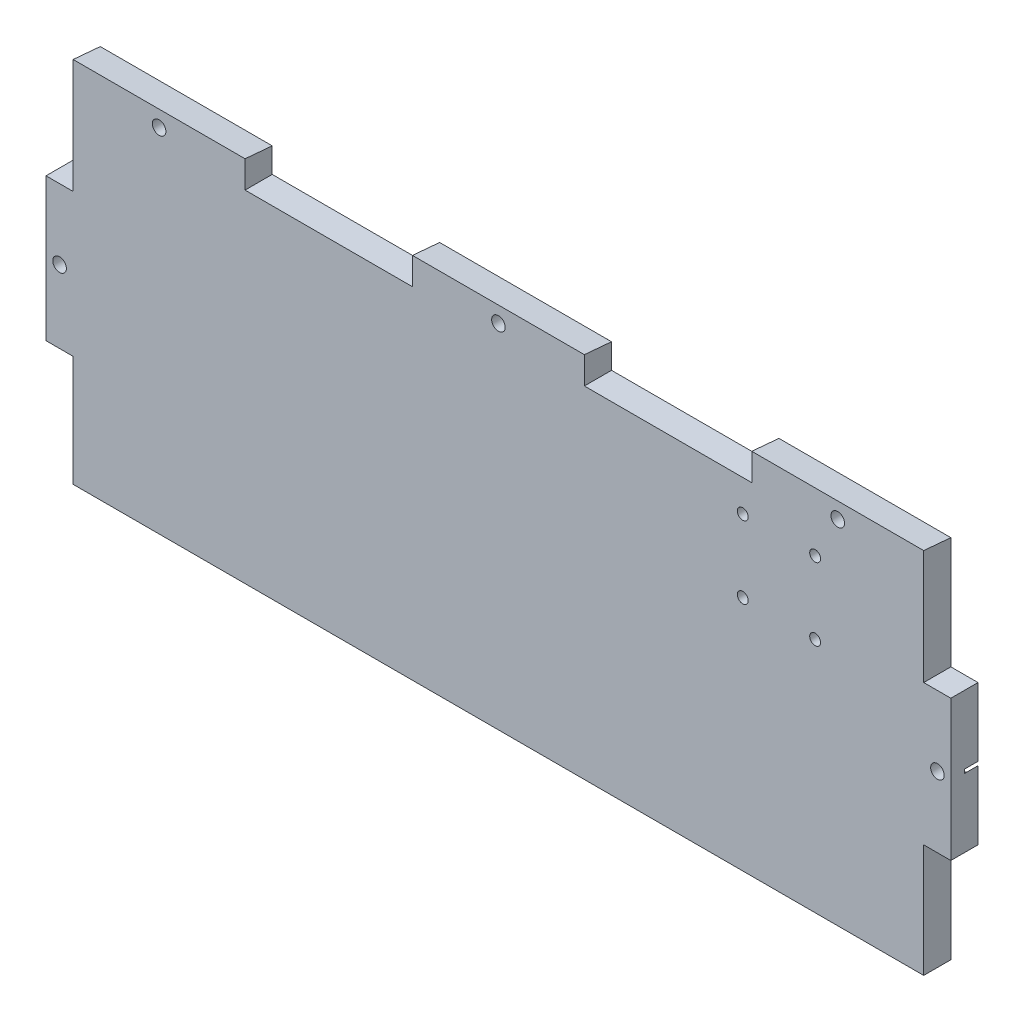
ISO-10303-21;
HEADER;
FILE_DESCRIPTION(('STEP AP214'),'2;1');
FILE_NAME('part.step','',(''),(''),'','','');
FILE_SCHEMA(('AUTOMOTIVE_DESIGN { 1 0 10303 214 1 1 1 1 }'));
ENDSEC;
DATA;
#1=APPLICATION_CONTEXT('core data for automotive mechanical design processes');
#2=APPLICATION_PROTOCOL_DEFINITION('international standard','automotive_design',2000,#1);
#3=PRODUCT_CONTEXT('',#1,'mechanical');
#4=PRODUCT('Part','Part','',(#3));
#5=PRODUCT_RELATED_PRODUCT_CATEGORY('part','',(#4));
#6=PRODUCT_DEFINITION_FORMATION('','',#4);
#7=PRODUCT_DEFINITION_CONTEXT('part definition',#1,'design');
#8=PRODUCT_DEFINITION('design','',#6,#7);
#9=PRODUCT_DEFINITION_SHAPE('','',#8);
#10=(LENGTH_UNIT() NAMED_UNIT(*) SI_UNIT(.MILLI.,.METRE.));
#11=(NAMED_UNIT(*) PLANE_ANGLE_UNIT() SI_UNIT($,.RADIAN.));
#12=(NAMED_UNIT(*) SI_UNIT($,.STERADIAN.) SOLID_ANGLE_UNIT());
#13=UNCERTAINTY_MEASURE_WITH_UNIT(LENGTH_MEASURE(1.E-05),#10,'distance_accuracy_value','');
#14=(GEOMETRIC_REPRESENTATION_CONTEXT(3) GLOBAL_UNCERTAINTY_ASSIGNED_CONTEXT((#13)) GLOBAL_UNIT_ASSIGNED_CONTEXT((#10,
#11,#12)) REPRESENTATION_CONTEXT('',''));
#15=CARTESIAN_POINT('',(0.,0.,0.));
#16=DIRECTION('',(0.,0.,1.));
#17=DIRECTION('',(1.,0.,0.));
#18=AXIS2_PLACEMENT_3D('',#15,#16,#17);
#19=CARTESIAN_POINT('',(-679.157205454483,81.33,6.));
#20=DIRECTION('',(0.,-0.996194698091746,0.0871557427476549));
#21=DIRECTION('',(0.,-0.0871557427476549,-0.996194698091746));
#22=AXIS2_PLACEMENT_3D('',#19,#20,#21);
#23=PLANE('',#22);
#24=DIRECTION('',(-1.,0.,0.));
#25=VECTOR('',#24,1.);
#26=CARTESIAN_POINT('',(0.,81.33,6.));
#27=LINE('',#26,#25);
#28=CARTESIAN_POINT('',(-75.,81.33,6.));
#29=VERTEX_POINT('',#28);
#30=CARTESIAN_POINT('',(-113.,81.33,6.));
#31=VERTEX_POINT('',#30);
#32=EDGE_CURVE('E434',#29,#31,#27,.T.);
#33=ORIENTED_EDGE('',*,*,#32,.F.);
#34=DIRECTION('',(0.,-0.0871557427476549,-0.996194698091746));
#35=VECTOR('',#34,1.);
#36=CARTESIAN_POINT('',(-75.,81.33,6.));
#37=LINE('',#36,#35);
#38=CARTESIAN_POINT('',(-75.,80.8050680188445,0.));
#39=VERTEX_POINT('',#38);
#40=EDGE_CURVE('E257',#29,#39,#37,.T.);
#41=ORIENTED_EDGE('',*,*,#40,.T.);
#42=DIRECTION('',(1.,0.,0.));
#43=VECTOR('',#42,1.);
#44=CARTESIAN_POINT('',(0.,80.8050680188444,0.));
#45=LINE('',#44,#43);
#46=CARTESIAN_POINT('',(-113.,80.8050680188445,0.));
#47=VERTEX_POINT('',#46);
#48=EDGE_CURVE('E453',#47,#39,#45,.T.);
#49=ORIENTED_EDGE('',*,*,#48,.F.);
#50=DIRECTION('',(0.,0.0871557427476549,0.996194698091746));
#51=VECTOR('',#50,1.);
#52=CARTESIAN_POINT('',(-113.,81.33,6.));
#53=LINE('',#52,#51);
#54=EDGE_CURVE('E248',#47,#31,#53,.T.);
#55=ORIENTED_EDGE('',*,*,#54,.T.);
#56=EDGE_LOOP('',(#33,#41,#49,#55));
#57=FACE_BOUND('',#56,.T.);
#58=ADVANCED_FACE('F34',(#57),#23,.F.);
#59=CARTESIAN_POINT('',(-150.,81.33,6.));
#60=VERTEX_POINT('',#59);
#61=CARTESIAN_POINT('',(-188.,81.33,6.));
#62=VERTEX_POINT('',#61);
#63=EDGE_CURVE('E435',#60,#62,#27,.T.);
#64=ORIENTED_EDGE('',*,*,#63,.F.);
#65=DIRECTION('',(0.,-0.0871557427476549,-0.996194698091746));
#66=VECTOR('',#65,1.);
#67=CARTESIAN_POINT('',(-150.,81.33,6.00000000000021));
#68=LINE('',#67,#66);
#69=CARTESIAN_POINT('',(-150.,80.8050680188445,0.));
#70=VERTEX_POINT('',#69);
#71=EDGE_CURVE('E251',#60,#70,#68,.T.);
#72=ORIENTED_EDGE('',*,*,#71,.T.);
#73=CARTESIAN_POINT('',(-188.,80.8050680188445,0.));
#74=VERTEX_POINT('',#73);
#75=EDGE_CURVE('E252',#74,#70,#45,.T.);
#76=ORIENTED_EDGE('',*,*,#75,.F.);
#77=DIRECTION('',(0.,-0.0871557427476549,-0.996194698091746));
#78=VECTOR('',#77,1.);
#79=CARTESIAN_POINT('',(-188.,80.7122072762415,-1.06140314482546));
#80=LINE('',#79,#78);
#81=EDGE_CURVE('E463',#62,#74,#80,.T.);
#82=ORIENTED_EDGE('',*,*,#81,.F.);
#83=EDGE_LOOP('',(#64,#72,#76,#82));
#84=FACE_BOUND('',#83,.T.);
#85=ADVANCED_FACE('F511',(#84),#23,.F.);
#86=CARTESIAN_POINT('',(0.,0.,6.));
#87=DIRECTION('',(-1.,0.,0.));
#88=DIRECTION('',(0.,0.,1.));
#89=AXIS2_PLACEMENT_3D('',#86,#87,#88);
#90=PLANE('',#89);
#91=DIRECTION('',(0.,0.,1.));
#92=VECTOR('',#91,1.);
#93=CARTESIAN_POINT('',(0.,56.0675340094222,6.));
#94=LINE('',#93,#92);
#95=CARTESIAN_POINT('',(0.,56.0675340094222,0.));
#96=VERTEX_POINT('',#95);
#97=CARTESIAN_POINT('',(0.,56.0675340094222,6.));
#98=VERTEX_POINT('',#97);
#99=EDGE_CURVE('E223',#96,#98,#94,.T.);
#100=ORIENTED_EDGE('',*,*,#99,.F.);
#101=DIRECTION('',(0.,1.,0.));
#102=VECTOR('',#101,1.);
#103=CARTESIAN_POINT('',(0.,0.,0.));
#104=LINE('',#103,#102);
#105=CARTESIAN_POINT('',(0.,80.8050680188444,0.));
#106=VERTEX_POINT('',#105);
#107=EDGE_CURVE('E401',#96,#106,#104,.T.);
#108=ORIENTED_EDGE('',*,*,#107,.T.);
#109=DIRECTION('',(0.,0.0871557427476549,0.996194698091746));
#110=VECTOR('',#109,1.);
#111=CARTESIAN_POINT('',(0.,80.7122072762415,-1.06140314482546));
#112=LINE('',#111,#110);
#113=CARTESIAN_POINT('',(0.,81.33,6.));
#114=VERTEX_POINT('',#113);
#115=EDGE_CURVE('E406',#106,#114,#112,.T.);
#116=ORIENTED_EDGE('',*,*,#115,.T.);
#117=DIRECTION('',(0.,1.,0.));
#118=VECTOR('',#117,1.);
#119=CARTESIAN_POINT('',(0.,0.,6.));
#120=LINE('',#119,#118);
#121=EDGE_CURVE('E225',#98,#114,#120,.T.);
#122=ORIENTED_EDGE('',*,*,#121,.F.);
#123=EDGE_LOOP('',(#100,#108,#116,#122));
#124=FACE_BOUND('',#123,.T.);
#125=ADVANCED_FACE('F36',(#124),#90,.F.);
#126=DIRECTION('',(0.,0.,-1.));
#127=VECTOR('',#126,1.);
#128=CARTESIAN_POINT('',(0.,25.,6.));
#129=LINE('',#128,#127);
#130=CARTESIAN_POINT('',(0.,25.,6.));
#131=VERTEX_POINT('',#130);
#132=CARTESIAN_POINT('',(0.,25.,0.));
#133=VERTEX_POINT('',#132);
#134=EDGE_CURVE('E219',#131,#133,#129,.T.);
#135=ORIENTED_EDGE('',*,*,#134,.F.);
#136=CARTESIAN_POINT('',(0.,0.,6.));
#137=VERTEX_POINT('',#136);
#138=EDGE_CURVE('E390',#137,#131,#120,.T.);
#139=ORIENTED_EDGE('',*,*,#138,.F.);
#140=DIRECTION('',(0.,0.,-1.));
#141=VECTOR('',#140,1.);
#142=CARTESIAN_POINT('',(0.,0.,6.));
#143=LINE('',#142,#141);
#144=CARTESIAN_POINT('',(0.,0.,0.));
#145=VERTEX_POINT('',#144);
#146=EDGE_CURVE('E446',#137,#145,#143,.T.);
#147=ORIENTED_EDGE('',*,*,#146,.T.);
#148=EDGE_CURVE('E395',#145,#133,#104,.T.);
#149=ORIENTED_EDGE('',*,*,#148,.T.);
#150=EDGE_LOOP('',(#135,#139,#147,#149));
#151=FACE_BOUND('',#150,.T.);
#152=ADVANCED_FACE('F449',(#151),#90,.F.);
#153=CARTESIAN_POINT('',(-188.,0.,6.));
#154=DIRECTION('',(1.,0.,0.));
#155=DIRECTION('',(0.,0.,-1.));
#156=AXIS2_PLACEMENT_3D('',#153,#154,#155);
#157=PLANE('',#156);
#158=DIRECTION('',(0.,0.,1.));
#159=VECTOR('',#158,1.);
#160=CARTESIAN_POINT('',(-188.,24.5,6.));
#161=LINE('',#160,#159);
#162=CARTESIAN_POINT('',(-188.,24.5,0.));
#163=VERTEX_POINT('',#162);
#164=CARTESIAN_POINT('',(-188.,24.5,6.));
#165=VERTEX_POINT('',#164);
#166=EDGE_CURVE('E478',#163,#165,#161,.T.);
#167=ORIENTED_EDGE('',*,*,#166,.F.);
#168=DIRECTION('',(0.,-1.,0.));
#169=VECTOR('',#168,1.);
#170=CARTESIAN_POINT('',(-188.,0.,0.));
#171=LINE('',#170,#169);
#172=CARTESIAN_POINT('',(-188.,0.,0.));
#173=VERTEX_POINT('',#172);
#174=EDGE_CURVE('E400',#163,#173,#171,.T.);
#175=ORIENTED_EDGE('',*,*,#174,.T.);
#176=DIRECTION('',(0.,0.,-1.));
#177=VECTOR('',#176,1.);
#178=CARTESIAN_POINT('',(-188.,0.,6.));
#179=LINE('',#178,#177);
#180=CARTESIAN_POINT('',(-188.,0.,6.));
#181=VERTEX_POINT('',#180);
#182=EDGE_CURVE('E448',#181,#173,#179,.T.);
#183=ORIENTED_EDGE('',*,*,#182,.F.);
#184=DIRECTION('',(0.,-1.,0.));
#185=VECTOR('',#184,1.);
#186=CARTESIAN_POINT('',(-188.,0.,6.));
#187=LINE('',#186,#185);
#188=EDGE_CURVE('E425',#165,#181,#187,.T.);
#189=ORIENTED_EDGE('',*,*,#188,.F.);
#190=EDGE_LOOP('',(#167,#175,#183,#189));
#191=FACE_BOUND('',#190,.T.);
#192=ADVANCED_FACE('F565',(#191),#157,.F.);
#193=DIRECTION('',(0.,0.,-1.));
#194=VECTOR('',#193,1.);
#195=CARTESIAN_POINT('',(-188.,56.0675340094222,6.));
#196=LINE('',#195,#194);
#197=CARTESIAN_POINT('',(-188.,56.0675340094222,6.));
#198=VERTEX_POINT('',#197);
#199=CARTESIAN_POINT('',(-188.,56.0675340094222,0.));
#200=VERTEX_POINT('',#199);
#201=EDGE_CURVE('E236',#198,#200,#196,.T.);
#202=ORIENTED_EDGE('',*,*,#201,.F.);
#203=EDGE_CURVE('E427',#62,#198,#187,.T.);
#204=ORIENTED_EDGE('',*,*,#203,.F.);
#205=ORIENTED_EDGE('',*,*,#81,.T.);
#206=EDGE_CURVE('E403',#74,#200,#171,.T.);
#207=ORIENTED_EDGE('',*,*,#206,.T.);
#208=EDGE_LOOP('',(#202,#204,#205,#207));
#209=FACE_BOUND('',#208,.T.);
#210=ADVANCED_FACE('F505',(#209),#157,.F.);
#211=CARTESIAN_POINT('',(0.,0.,6.));
#212=DIRECTION('',(0.,1.,0.));
#213=DIRECTION('',(-1.,0.,0.));
#214=AXIS2_PLACEMENT_3D('',#211,#212,#213);
#215=PLANE('',#214);
#216=DIRECTION('',(1.,0.,0.));
#217=VECTOR('',#216,1.);
#218=CARTESIAN_POINT('',(0.,0.,0.));
#219=LINE('',#218,#217);
#220=EDGE_CURVE('E397',#173,#145,#219,.T.);
#221=ORIENTED_EDGE('',*,*,#220,.T.);
#222=ORIENTED_EDGE('',*,*,#146,.F.);
#223=DIRECTION('',(1.,0.,0.));
#224=VECTOR('',#223,1.);
#225=CARTESIAN_POINT('',(0.,0.,6.));
#226=LINE('',#225,#224);
#227=EDGE_CURVE('E415',#181,#137,#226,.T.);
#228=ORIENTED_EDGE('',*,*,#227,.F.);
#229=ORIENTED_EDGE('',*,*,#182,.T.);
#230=EDGE_LOOP('',(#221,#222,#228,#229));
#231=FACE_BOUND('',#230,.T.);
#232=ADVANCED_FACE('F444',(#231),#215,.F.);
#233=CARTESIAN_POINT('',(0.,0.,6.));
#234=DIRECTION('',(0.,0.,1.));
#235=DIRECTION('',(1.,0.,0.));
#236=AXIS2_PLACEMENT_3D('',#233,#234,#235);
#237=PLANE('',#236);
#238=CARTESIAN_POINT('',(-40.,52.33,6.));
#239=DIRECTION('',(0.,0.,1.));
#240=DIRECTION('',(1.,0.,0.));
#241=AXIS2_PLACEMENT_3D('',#238,#239,#240);
#242=CIRCLE('',#241,1.2);
#243=CARTESIAN_POINT('',(-38.8,52.33,6.));
#244=VERTEX_POINT('',#243);
#245=EDGE_CURVE('E300',#244,#244,#242,.T.);
#246=ORIENTED_EDGE('',*,*,#245,.F.);
#247=EDGE_LOOP('',(#246));
#248=FACE_BOUND('',#247,.T.);
#249=CARTESIAN_POINT('',(-40.,68.33,6.));
#250=DIRECTION('',(0.,0.,1.));
#251=DIRECTION('',(1.,0.,0.));
#252=AXIS2_PLACEMENT_3D('',#249,#250,#251);
#253=CIRCLE('',#252,1.20000000000001);
#254=CARTESIAN_POINT('',(-38.8,68.33,6.));
#255=VERTEX_POINT('',#254);
#256=EDGE_CURVE('E290',#255,#255,#253,.T.);
#257=ORIENTED_EDGE('',*,*,#256,.F.);
#258=EDGE_LOOP('',(#257));
#259=FACE_BOUND('',#258,.T.);
#260=CARTESIAN_POINT('',(-24.,52.33,6.));
#261=DIRECTION('',(0.,0.,1.));
#262=DIRECTION('',(1.,0.,0.));
#263=AXIS2_PLACEMENT_3D('',#260,#261,#262);
#264=CIRCLE('',#263,1.2);
#265=CARTESIAN_POINT('',(-22.8,52.33,6.));
#266=VERTEX_POINT('',#265);
#267=EDGE_CURVE('E287',#266,#266,#264,.T.);
#268=ORIENTED_EDGE('',*,*,#267,.F.);
#269=EDGE_LOOP('',(#268));
#270=FACE_BOUND('',#269,.T.);
#271=CARTESIAN_POINT('',(-24.,68.33,6.));
#272=DIRECTION('',(0.,0.,1.));
#273=DIRECTION('',(1.,0.,0.));
#274=AXIS2_PLACEMENT_3D('',#271,#272,#273);
#275=CIRCLE('',#274,1.20000000000002);
#276=CARTESIAN_POINT('',(-22.8,68.33,6.));
#277=VERTEX_POINT('',#276);
#278=EDGE_CURVE('E284',#277,#277,#275,.T.);
#279=ORIENTED_EDGE('',*,*,#278,.F.);
#280=EDGE_LOOP('',(#279));
#281=FACE_BOUND('',#280,.T.);
#282=CARTESIAN_POINT('',(-191.,40.5675340094222,6.));
#283=DIRECTION('',(0.,0.,-1.));
#284=DIRECTION('',(-1.,0.,0.));
#285=AXIS2_PLACEMENT_3D('',#282,#283,#284);
#286=CIRCLE('',#285,1.5);
#287=CARTESIAN_POINT('',(-192.5,40.5675340094222,6.));
#288=VERTEX_POINT('',#287);
#289=EDGE_CURVE('E280',#288,#288,#286,.T.);
#290=ORIENTED_EDGE('',*,*,#289,.T.);
#291=EDGE_LOOP('',(#290));
#292=FACE_BOUND('',#291,.T.);
#293=CARTESIAN_POINT('',(-169.,77.8050680188445,6.));
#294=DIRECTION('',(0.,0.,-1.));
#295=DIRECTION('',(-1.,0.,0.));
#296=AXIS2_PLACEMENT_3D('',#293,#294,#295);
#297=CIRCLE('',#296,1.5);
#298=CARTESIAN_POINT('',(-170.5,77.8050680188445,6.));
#299=VERTEX_POINT('',#298);
#300=EDGE_CURVE('E276',#299,#299,#297,.T.);
#301=ORIENTED_EDGE('',*,*,#300,.T.);
#302=EDGE_LOOP('',(#301));
#303=FACE_BOUND('',#302,.T.);
#304=CARTESIAN_POINT('',(-94.,77.8050680188445,6.));
#305=DIRECTION('',(0.,0.,-1.));
#306=DIRECTION('',(-1.,0.,0.));
#307=AXIS2_PLACEMENT_3D('',#304,#305,#306);
#308=CIRCLE('',#307,1.5);
#309=CARTESIAN_POINT('',(-95.5,77.8050680188445,6.));
#310=VERTEX_POINT('',#309);
#311=EDGE_CURVE('E272',#310,#310,#308,.T.);
#312=ORIENTED_EDGE('',*,*,#311,.T.);
#313=EDGE_LOOP('',(#312));
#314=FACE_BOUND('',#313,.T.);
#315=CARTESIAN_POINT('',(-19.,77.8050680188445,6.));
#316=DIRECTION('',(0.,0.,-1.));
#317=DIRECTION('',(-1.,0.,0.));
#318=AXIS2_PLACEMENT_3D('',#315,#316,#317);
#319=CIRCLE('',#318,1.5);
#320=CARTESIAN_POINT('',(-20.5,77.8050680188445,6.));
#321=VERTEX_POINT('',#320);
#322=EDGE_CURVE('E268',#321,#321,#319,.T.);
#323=ORIENTED_EDGE('',*,*,#322,.T.);
#324=EDGE_LOOP('',(#323));
#325=FACE_BOUND('',#324,.T.);
#326=CARTESIAN_POINT('',(3.03401441182416,40.5675340094222,6.));
#327=DIRECTION('',(0.,0.,-1.));
#328=DIRECTION('',(-1.,0.,0.));
#329=AXIS2_PLACEMENT_3D('',#326,#327,#328);
#330=CIRCLE('',#329,1.5);
#331=CARTESIAN_POINT('',(1.53401441182416,40.5675340094222,6.));
#332=VERTEX_POINT('',#331);
#333=EDGE_CURVE('E264',#332,#332,#330,.T.);
#334=ORIENTED_EDGE('',*,*,#333,.T.);
#335=EDGE_LOOP('',(#334));
#336=FACE_BOUND('',#335,.T.);
#337=DIRECTION('',(0.,-1.,0.));
#338=VECTOR('',#337,1.);
#339=CARTESIAN_POINT('',(-75.,81.33,6.));
#340=LINE('',#339,#338);
#341=CARTESIAN_POINT('',(-75.,75.33,6.));
#342=VERTEX_POINT('',#341);
#343=EDGE_CURVE('E338',#29,#342,#340,.T.);
#344=ORIENTED_EDGE('',*,*,#343,.F.);
#345=ORIENTED_EDGE('',*,*,#32,.T.);
#346=DIRECTION('',(0.,1.,0.));
#347=VECTOR('',#346,1.);
#348=CARTESIAN_POINT('',(-113.,81.33,6.));
#349=LINE('',#348,#347);
#350=CARTESIAN_POINT('',(-113.,75.33,6.));
#351=VERTEX_POINT('',#350);
#352=EDGE_CURVE('E365',#351,#31,#349,.T.);
#353=ORIENTED_EDGE('',*,*,#352,.F.);
#354=DIRECTION('',(1.,0.,0.));
#355=VECTOR('',#354,1.);
#356=CARTESIAN_POINT('',(-150.,75.33,6.));
#357=LINE('',#356,#355);
#358=CARTESIAN_POINT('',(-150.,75.33,6.));
#359=VERTEX_POINT('',#358);
#360=EDGE_CURVE('E374',#359,#351,#357,.T.);
#361=ORIENTED_EDGE('',*,*,#360,.F.);
#362=DIRECTION('',(0.,-1.,0.));
#363=VECTOR('',#362,1.);
#364=CARTESIAN_POINT('',(-150.,81.33,6.));
#365=LINE('',#364,#363);
#366=EDGE_CURVE('E359',#60,#359,#365,.T.);
#367=ORIENTED_EDGE('',*,*,#366,.F.);
#368=ORIENTED_EDGE('',*,*,#63,.T.);
#369=ORIENTED_EDGE('',*,*,#203,.T.);
#370=DIRECTION('',(1.,0.,0.));
#371=VECTOR('',#370,1.);
#372=CARTESIAN_POINT('',(-194.,56.0675340094222,6.));
#373=LINE('',#372,#371);
#374=CARTESIAN_POINT('',(-194.,56.0675340094222,6.));
#375=VERTEX_POINT('',#374);
#376=EDGE_CURVE('E465',#375,#198,#373,.T.);
#377=ORIENTED_EDGE('',*,*,#376,.F.);
#378=DIRECTION('',(0.,1.,0.));
#379=VECTOR('',#378,1.);
#380=CARTESIAN_POINT('',(-194.,56.0675340094222,6.));
#381=LINE('',#380,#379);
#382=CARTESIAN_POINT('',(-194.,24.5,6.));
#383=VERTEX_POINT('',#382);
#384=EDGE_CURVE('E482',#383,#375,#381,.T.);
#385=ORIENTED_EDGE('',*,*,#384,.F.);
#386=DIRECTION('',(1.,0.,0.));
#387=VECTOR('',#386,1.);
#388=CARTESIAN_POINT('',(-194.,24.5,6.));
#389=LINE('',#388,#387);
#390=EDGE_CURVE('E484',#383,#165,#389,.T.);
#391=ORIENTED_EDGE('',*,*,#390,.T.);
#392=ORIENTED_EDGE('',*,*,#188,.T.);
#393=ORIENTED_EDGE('',*,*,#227,.T.);
#394=ORIENTED_EDGE('',*,*,#138,.T.);
#395=DIRECTION('',(-1.,0.,0.));
#396=VECTOR('',#395,1.);
#397=CARTESIAN_POINT('',(6.,25.,6.));
#398=LINE('',#397,#396);
#399=CARTESIAN_POINT('',(6.,25.,6.));
#400=VERTEX_POINT('',#399);
#401=EDGE_CURVE('E231',#400,#131,#398,.T.);
#402=ORIENTED_EDGE('',*,*,#401,.F.);
#403=DIRECTION('',(0.,-1.,0.));
#404=VECTOR('',#403,1.);
#405=CARTESIAN_POINT('',(6.,25.,6.));
#406=LINE('',#405,#404);
#407=CARTESIAN_POINT('',(6.,56.0675340094222,6.));
#408=VERTEX_POINT('',#407);
#409=EDGE_CURVE('E208',#408,#400,#406,.T.);
#410=ORIENTED_EDGE('',*,*,#409,.F.);
#411=DIRECTION('',(-1.,0.,0.));
#412=VECTOR('',#411,1.);
#413=CARTESIAN_POINT('',(6.,56.0675340094222,6.));
#414=LINE('',#413,#412);
#415=EDGE_CURVE('E213',#408,#98,#414,.T.);
#416=ORIENTED_EDGE('',*,*,#415,.T.);
#417=ORIENTED_EDGE('',*,*,#121,.T.);
#418=CARTESIAN_POINT('',(-38.,81.33,6.));
#419=VERTEX_POINT('',#418);
#420=EDGE_CURVE('E428',#114,#419,#27,.T.);
#421=ORIENTED_EDGE('',*,*,#420,.T.);
#422=DIRECTION('',(0.,1.,0.));
#423=VECTOR('',#422,1.);
#424=CARTESIAN_POINT('',(-38.,81.33,6.));
#425=LINE('',#424,#423);
#426=CARTESIAN_POINT('',(-38.,75.33,6.));
#427=VERTEX_POINT('',#426);
#428=EDGE_CURVE('E58',#427,#419,#425,.T.);
#429=ORIENTED_EDGE('',*,*,#428,.F.);
#430=DIRECTION('',(1.,0.,0.));
#431=VECTOR('',#430,1.);
#432=CARTESIAN_POINT('',(-75.,75.33,6.));
#433=LINE('',#432,#431);
#434=EDGE_CURVE('E353',#342,#427,#433,.T.);
#435=ORIENTED_EDGE('',*,*,#434,.F.);
#436=EDGE_LOOP('',(#344,#345,#353,#361,#367,#368,#369,#377,#385,#391,#392,#393,#394,#402,#410,
#416,#417,#421,#429,#435));
#437=FACE_BOUND('',#436,.T.);
#438=ADVANCED_FACE('F388',(#248,#259,#270,#281,#292,#303,#314,#325,#336,#437),#237,.T.);
#439=CARTESIAN_POINT('',(0.,0.,0.));
#440=DIRECTION('',(0.,0.,1.));
#441=DIRECTION('',(1.,0.,0.));
#442=AXIS2_PLACEMENT_3D('',#439,#440,#441);
#443=PLANE('',#442);
#444=CARTESIAN_POINT('',(-40.,52.33,0.));
#445=DIRECTION('',(0.,0.,1.));
#446=DIRECTION('',(1.,0.,0.));
#447=AXIS2_PLACEMENT_3D('',#444,#445,#446);
#448=CIRCLE('',#447,1.2);
#449=CARTESIAN_POINT('',(-38.8,52.33,0.));
#450=VERTEX_POINT('',#449);
#451=EDGE_CURVE('E38',#450,#450,#448,.T.);
#452=ORIENTED_EDGE('',*,*,#451,.T.);
#453=EDGE_LOOP('',(#452));
#454=FACE_BOUND('',#453,.T.);
#455=CARTESIAN_POINT('',(-40.,68.33,0.));
#456=DIRECTION('',(0.,0.,1.));
#457=DIRECTION('',(1.,0.,0.));
#458=AXIS2_PLACEMENT_3D('',#455,#456,#457);
#459=CIRCLE('',#458,1.20000000000001);
#460=CARTESIAN_POINT('',(-38.8,68.33,0.));
#461=VERTEX_POINT('',#460);
#462=EDGE_CURVE('E288',#461,#461,#459,.T.);
#463=ORIENTED_EDGE('',*,*,#462,.T.);
#464=EDGE_LOOP('',(#463));
#465=FACE_BOUND('',#464,.T.);
#466=CARTESIAN_POINT('',(-24.,52.33,0.));
#467=DIRECTION('',(0.,0.,1.));
#468=DIRECTION('',(1.,0.,0.));
#469=AXIS2_PLACEMENT_3D('',#466,#467,#468);
#470=CIRCLE('',#469,1.2);
#471=CARTESIAN_POINT('',(-22.8,52.33,0.));
#472=VERTEX_POINT('',#471);
#473=EDGE_CURVE('E285',#472,#472,#470,.T.);
#474=ORIENTED_EDGE('',*,*,#473,.T.);
#475=EDGE_LOOP('',(#474));
#476=FACE_BOUND('',#475,.T.);
#477=CARTESIAN_POINT('',(-24.,68.33,0.));
#478=DIRECTION('',(0.,0.,1.));
#479=DIRECTION('',(1.,0.,0.));
#480=AXIS2_PLACEMENT_3D('',#477,#478,#479);
#481=CIRCLE('',#480,1.20000000000002);
#482=CARTESIAN_POINT('',(-22.8,68.33,0.));
#483=VERTEX_POINT('',#482);
#484=EDGE_CURVE('E281',#483,#483,#481,.T.);
#485=ORIENTED_EDGE('',*,*,#484,.T.);
#486=EDGE_LOOP('',(#485));
#487=FACE_BOUND('',#486,.T.);
#488=CARTESIAN_POINT('',(-191.,40.5675340094222,0.));
#489=DIRECTION('',(0.,0.,-1.));
#490=DIRECTION('',(-1.,0.,0.));
#491=AXIS2_PLACEMENT_3D('',#488,#489,#490);
#492=CIRCLE('',#491,2.995);
#493=CARTESIAN_POINT('',(-193.995,40.5675340094222,0.));
#494=VERTEX_POINT('',#493);
#495=EDGE_CURVE('E315',#494,#494,#492,.T.);
#496=ORIENTED_EDGE('',*,*,#495,.F.);
#497=EDGE_LOOP('',(#496));
#498=FACE_BOUND('',#497,.T.);
#499=CARTESIAN_POINT('',(-169.,77.8050680188445,0.));
#500=DIRECTION('',(0.,0.,-1.));
#501=DIRECTION('',(-1.,0.,0.));
#502=AXIS2_PLACEMENT_3D('',#499,#500,#501);
#503=CIRCLE('',#502,2.995);
#504=CARTESIAN_POINT('',(-171.995,77.8050680188445,0.));
#505=VERTEX_POINT('',#504);
#506=EDGE_CURVE('E320',#505,#505,#503,.T.);
#507=ORIENTED_EDGE('',*,*,#506,.F.);
#508=EDGE_LOOP('',(#507));
#509=FACE_BOUND('',#508,.T.);
#510=CARTESIAN_POINT('',(-19.,77.8050680188445,0.));
#511=DIRECTION('',(0.,0.,-1.));
#512=DIRECTION('',(-1.,0.,0.));
#513=AXIS2_PLACEMENT_3D('',#510,#511,#512);
#514=CIRCLE('',#513,2.995);
#515=CARTESIAN_POINT('',(-21.995,77.8050680188445,0.));
#516=VERTEX_POINT('',#515);
#517=EDGE_CURVE('E326',#516,#516,#514,.T.);
#518=ORIENTED_EDGE('',*,*,#517,.F.);
#519=EDGE_LOOP('',(#518));
#520=FACE_BOUND('',#519,.T.);
#521=CARTESIAN_POINT('',(-94.,77.8050680188445,0.));
#522=DIRECTION('',(0.,0.,-1.));
#523=DIRECTION('',(-1.,0.,0.));
#524=AXIS2_PLACEMENT_3D('',#521,#522,#523);
#525=CIRCLE('',#524,2.995);
#526=CARTESIAN_POINT('',(-96.995,77.8050680188445,0.));
#527=VERTEX_POINT('',#526);
#528=EDGE_CURVE('E332',#527,#527,#525,.T.);
#529=ORIENTED_EDGE('',*,*,#528,.F.);
#530=EDGE_LOOP('',(#529));
#531=FACE_BOUND('',#530,.T.);
#532=DIRECTION('',(0.,1.,0.));
#533=VECTOR('',#532,1.);
#534=CARTESIAN_POINT('',(6.,25.,0.));
#535=LINE('',#534,#533);
#536=CARTESIAN_POINT('',(6.,40.9834119851954,0.));
#537=VERTEX_POINT('',#536);
#538=CARTESIAN_POINT('',(6.,56.0675340094222,0.));
#539=VERTEX_POINT('',#538);
#540=EDGE_CURVE('E196',#537,#539,#535,.T.);
#541=ORIENTED_EDGE('',*,*,#540,.F.);
#542=CARTESIAN_POINT('',(3.03401441182416,40.5675340094222,0.));
#543=DIRECTION('',(0.,0.,-1.));
#544=DIRECTION('',(-1.,0.,0.));
#545=AXIS2_PLACEMENT_3D('',#542,#543,#544);
#546=CIRCLE('',#545,2.995);
#547=CARTESIAN_POINT('',(6.,40.151656033649,0.));
#548=VERTEX_POINT('',#547);
#549=EDGE_CURVE('E184',#548,#537,#546,.T.);
#550=ORIENTED_EDGE('',*,*,#549,.F.);
#551=CARTESIAN_POINT('',(6.,25.,0.));
#552=VERTEX_POINT('',#551);
#553=EDGE_CURVE('E204',#552,#548,#535,.T.);
#554=ORIENTED_EDGE('',*,*,#553,.F.);
#555=DIRECTION('',(-1.,0.,0.));
#556=VECTOR('',#555,1.);
#557=CARTESIAN_POINT('',(6.,25.,0.));
#558=LINE('',#557,#556);
#559=EDGE_CURVE('E228',#552,#133,#558,.T.);
#560=ORIENTED_EDGE('',*,*,#559,.T.);
#561=ORIENTED_EDGE('',*,*,#148,.F.);
#562=ORIENTED_EDGE('',*,*,#220,.F.);
#563=ORIENTED_EDGE('',*,*,#174,.F.);
#564=DIRECTION('',(1.,0.,0.));
#565=VECTOR('',#564,1.);
#566=CARTESIAN_POINT('',(-194.,24.5,0.));
#567=LINE('',#566,#565);
#568=CARTESIAN_POINT('',(-194.,24.5,0.));
#569=VERTEX_POINT('',#568);
#570=EDGE_CURVE('E487',#569,#163,#567,.T.);
#571=ORIENTED_EDGE('',*,*,#570,.F.);
#572=DIRECTION('',(0.,-1.,0.));
#573=VECTOR('',#572,1.);
#574=CARTESIAN_POINT('',(-194.,56.0675340094222,0.));
#575=LINE('',#574,#573);
#576=CARTESIAN_POINT('',(-194.,56.0675340094222,0.));
#577=VERTEX_POINT('',#576);
#578=EDGE_CURVE('E573',#577,#569,#575,.T.);
#579=ORIENTED_EDGE('',*,*,#578,.F.);
#580=DIRECTION('',(1.,0.,0.));
#581=VECTOR('',#580,1.);
#582=CARTESIAN_POINT('',(-194.,56.0675340094222,0.));
#583=LINE('',#582,#581);
#584=EDGE_CURVE('E470',#577,#200,#583,.T.);
#585=ORIENTED_EDGE('',*,*,#584,.T.);
#586=ORIENTED_EDGE('',*,*,#206,.F.);
#587=ORIENTED_EDGE('',*,*,#75,.T.);
#588=DIRECTION('',(0.,-1.,0.));
#589=VECTOR('',#588,1.);
#590=CARTESIAN_POINT('',(-150.,81.33,0.));
#591=LINE('',#590,#589);
#592=CARTESIAN_POINT('',(-150.,75.33,0.));
#593=VERTEX_POINT('',#592);
#594=EDGE_CURVE('E361',#70,#593,#591,.T.);
#595=ORIENTED_EDGE('',*,*,#594,.T.);
#596=DIRECTION('',(1.,0.,0.));
#597=VECTOR('',#596,1.);
#598=CARTESIAN_POINT('',(-150.,75.33,0.));
#599=LINE('',#598,#597);
#600=CARTESIAN_POINT('',(-113.,75.33,0.));
#601=VERTEX_POINT('',#600);
#602=EDGE_CURVE('E364',#593,#601,#599,.T.);
#603=ORIENTED_EDGE('',*,*,#602,.T.);
#604=DIRECTION('',(0.,1.,0.));
#605=VECTOR('',#604,1.);
#606=CARTESIAN_POINT('',(-113.,81.33,0.));
#607=LINE('',#606,#605);
#608=EDGE_CURVE('E368',#601,#47,#607,.T.);
#609=ORIENTED_EDGE('',*,*,#608,.T.);
#610=ORIENTED_EDGE('',*,*,#48,.T.);
#611=DIRECTION('',(0.,-1.,0.));
#612=VECTOR('',#611,1.);
#613=CARTESIAN_POINT('',(-75.,81.33,0.));
#614=LINE('',#613,#612);
#615=CARTESIAN_POINT('',(-75.,75.33,0.));
#616=VERTEX_POINT('',#615);
#617=EDGE_CURVE('E341',#39,#616,#614,.T.);
#618=ORIENTED_EDGE('',*,*,#617,.T.);
#619=DIRECTION('',(1.,0.,0.));
#620=VECTOR('',#619,1.);
#621=CARTESIAN_POINT('',(-75.,75.33,0.));
#622=LINE('',#621,#620);
#623=CARTESIAN_POINT('',(-38.,75.33,0.));
#624=VERTEX_POINT('',#623);
#625=EDGE_CURVE('E344',#616,#624,#622,.T.);
#626=ORIENTED_EDGE('',*,*,#625,.T.);
#627=DIRECTION('',(0.,1.,0.));
#628=VECTOR('',#627,1.);
#629=CARTESIAN_POINT('',(-38.,81.33,0.));
#630=LINE('',#629,#628);
#631=CARTESIAN_POINT('',(-38.,80.8050680188445,0.));
#632=VERTEX_POINT('',#631);
#633=EDGE_CURVE('E347',#624,#632,#630,.T.);
#634=ORIENTED_EDGE('',*,*,#633,.T.);
#635=EDGE_CURVE('E450',#632,#106,#45,.T.);
#636=ORIENTED_EDGE('',*,*,#635,.T.);
#637=ORIENTED_EDGE('',*,*,#107,.F.);
#638=DIRECTION('',(-1.,0.,0.));
#639=VECTOR('',#638,1.);
#640=CARTESIAN_POINT('',(6.,56.0675340094222,0.));
#641=LINE('',#640,#639);
#642=EDGE_CURVE('E202',#539,#96,#641,.T.);
#643=ORIENTED_EDGE('',*,*,#642,.F.);
#644=EDGE_LOOP('',(#541,#550,#554,#560,#561,#562,#563,#571,#579,#585,#586,#587,#595,#603,#609,
#610,#618,#626,#634,#636,#637,#643));
#645=FACE_BOUND('',#644,.T.);
#646=ADVANCED_FACE('F199',(#454,#465,#476,#487,#498,#509,#520,#531,#645),#443,.F.);
#647=ORIENTED_EDGE('',*,*,#635,.F.);
#648=DIRECTION('',(0.,0.0871557427476549,0.996194698091746));
#649=VECTOR('',#648,1.);
#650=CARTESIAN_POINT('',(-38.,81.33,6.));
#651=LINE('',#650,#649);
#652=EDGE_CURVE('E255',#632,#419,#651,.T.);
#653=ORIENTED_EDGE('',*,*,#652,.T.);
#654=ORIENTED_EDGE('',*,*,#420,.F.);
#655=ORIENTED_EDGE('',*,*,#115,.F.);
#656=EDGE_LOOP('',(#647,#653,#654,#655));
#657=FACE_BOUND('',#656,.T.);
#658=ADVANCED_FACE('F462',(#657),#23,.F.);
#659=CARTESIAN_POINT('',(-194.,56.0675340094222,6.));
#660=DIRECTION('',(0.,-1.,0.));
#661=DIRECTION('',(0.,0.,-1.));
#662=AXIS2_PLACEMENT_3D('',#659,#660,#661);
#663=PLANE('',#662);
#664=ORIENTED_EDGE('',*,*,#201,.T.);
#665=ORIENTED_EDGE('',*,*,#584,.F.);
#666=DIRECTION('',(0.,0.,-1.));
#667=VECTOR('',#666,1.);
#668=CARTESIAN_POINT('',(-194.,56.0675340094222,6.));
#669=LINE('',#668,#667);
#670=EDGE_CURVE('E576',#375,#577,#669,.T.);
#671=ORIENTED_EDGE('',*,*,#670,.F.);
#672=ORIENTED_EDGE('',*,*,#376,.T.);
#673=EDGE_LOOP('',(#664,#665,#671,#672));
#674=FACE_BOUND('',#673,.T.);
#675=ADVANCED_FACE('F502',(#674),#663,.F.);
#676=CARTESIAN_POINT('',(-194.,24.5,6.));
#677=DIRECTION('',(0.,1.,0.));
#678=DIRECTION('',(0.,0.,1.));
#679=AXIS2_PLACEMENT_3D('',#676,#677,#678);
#680=PLANE('',#679);
#681=ORIENTED_EDGE('',*,*,#166,.T.);
#682=ORIENTED_EDGE('',*,*,#390,.F.);
#683=DIRECTION('',(0.,0.,1.));
#684=VECTOR('',#683,1.);
#685=CARTESIAN_POINT('',(-194.,24.5,6.));
#686=LINE('',#685,#684);
#687=EDGE_CURVE('E488',#569,#383,#686,.T.);
#688=ORIENTED_EDGE('',*,*,#687,.F.);
#689=ORIENTED_EDGE('',*,*,#570,.T.);
#690=EDGE_LOOP('',(#681,#682,#688,#689));
#691=FACE_BOUND('',#690,.T.);
#692=ADVANCED_FACE('F554',(#691),#680,.F.);
#693=CARTESIAN_POINT('',(-194.,0.,0.));
#694=DIRECTION('',(1.,0.,0.));
#695=DIRECTION('',(0.,0.,-1.));
#696=AXIS2_PLACEMENT_3D('',#693,#694,#695);
#697=PLANE('',#696);
#698=ORIENTED_EDGE('',*,*,#384,.T.);
#699=ORIENTED_EDGE('',*,*,#670,.T.);
#700=ORIENTED_EDGE('',*,*,#578,.T.);
#701=ORIENTED_EDGE('',*,*,#687,.T.);
#702=EDGE_LOOP('',(#698,#699,#700,#701));
#703=FACE_BOUND('',#702,.T.);
#704=ADVANCED_FACE('F579',(#703),#697,.F.);
#705=CARTESIAN_POINT('',(6.,25.,6.));
#706=DIRECTION('',(0.,1.,0.));
#707=DIRECTION('',(0.,0.,1.));
#708=AXIS2_PLACEMENT_3D('',#705,#706,#707);
#709=PLANE('',#708);
#710=ORIENTED_EDGE('',*,*,#134,.T.);
#711=ORIENTED_EDGE('',*,*,#559,.F.);
#712=DIRECTION('',(0.,0.,-1.));
#713=VECTOR('',#712,1.);
#714=CARTESIAN_POINT('',(6.,25.,6.));
#715=LINE('',#714,#713);
#716=EDGE_CURVE('E205',#400,#552,#715,.T.);
#717=ORIENTED_EDGE('',*,*,#716,.F.);
#718=ORIENTED_EDGE('',*,*,#401,.T.);
#719=EDGE_LOOP('',(#710,#711,#717,#718));
#720=FACE_BOUND('',#719,.T.);
#721=ADVANCED_FACE('F392',(#720),#709,.F.);
#722=CARTESIAN_POINT('',(6.,56.0675340094222,6.));
#723=DIRECTION('',(0.,-1.,0.));
#724=DIRECTION('',(0.,0.,-1.));
#725=AXIS2_PLACEMENT_3D('',#722,#723,#724);
#726=PLANE('',#725);
#727=ORIENTED_EDGE('',*,*,#99,.T.);
#728=ORIENTED_EDGE('',*,*,#415,.F.);
#729=DIRECTION('',(0.,0.,1.));
#730=VECTOR('',#729,1.);
#731=CARTESIAN_POINT('',(6.,56.0675340094222,6.));
#732=LINE('',#731,#730);
#733=EDGE_CURVE('E207',#539,#408,#732,.T.);
#734=ORIENTED_EDGE('',*,*,#733,.F.);
#735=ORIENTED_EDGE('',*,*,#642,.T.);
#736=EDGE_LOOP('',(#727,#728,#734,#735));
#737=FACE_BOUND('',#736,.T.);
#738=ADVANCED_FACE('F586',(#737),#726,.F.);
#739=CARTESIAN_POINT('',(6.,0.,0.));
#740=DIRECTION('',(-1.,0.,0.));
#741=DIRECTION('',(0.,0.,1.));
#742=AXIS2_PLACEMENT_3D('',#739,#740,#741);
#743=PLANE('',#742);
#744=DIRECTION('',(0.,-1.,0.));
#745=VECTOR('',#744,1.);
#746=CARTESIAN_POINT('',(6.,0.,3.));
#747=LINE('',#746,#745);
#748=CARTESIAN_POINT('',(6.,40.9834119851954,3.));
#749=VERTEX_POINT('',#748);
#750=CARTESIAN_POINT('',(6.,40.151656033649,3.));
#751=VERTEX_POINT('',#750);
#752=EDGE_CURVE('E198',#749,#751,#747,.T.);
#753=ORIENTED_EDGE('',*,*,#752,.F.);
#754=DIRECTION('',(0.,0.,-1.));
#755=VECTOR('',#754,1.);
#756=CARTESIAN_POINT('',(6.,40.9834119851954,3.));
#757=LINE('',#756,#755);
#758=EDGE_CURVE('E11',#749,#537,#757,.T.);
#759=ORIENTED_EDGE('',*,*,#758,.T.);
#760=ORIENTED_EDGE('',*,*,#540,.T.);
#761=ORIENTED_EDGE('',*,*,#733,.T.);
#762=ORIENTED_EDGE('',*,*,#409,.T.);
#763=ORIENTED_EDGE('',*,*,#716,.T.);
#764=ORIENTED_EDGE('',*,*,#553,.T.);
#765=DIRECTION('',(0.,0.,-1.));
#766=VECTOR('',#765,1.);
#767=CARTESIAN_POINT('',(6.,40.151656033649,3.));
#768=LINE('',#767,#766);
#769=EDGE_CURVE('E43',#548,#751,#768,.F.);
#770=ORIENTED_EDGE('',*,*,#769,.T.);
#771=EDGE_LOOP('',(#753,#759,#760,#761,#762,#763,#764,#770));
#772=FACE_BOUND('',#771,.T.);
#773=ADVANCED_FACE('F195',(#772),#743,.F.);
#774=CARTESIAN_POINT('',(-150.,81.33,0.));
#775=DIRECTION('',(-1.,0.,0.));
#776=DIRECTION('',(0.,-1.,0.));
#777=AXIS2_PLACEMENT_3D('',#774,#775,#776);
#778=PLANE('',#777);
#779=ORIENTED_EDGE('',*,*,#366,.T.);
#780=DIRECTION('',(0.,0.,1.));
#781=VECTOR('',#780,1.);
#782=CARTESIAN_POINT('',(-150.,75.33,0.));
#783=LINE('',#782,#781);
#784=EDGE_CURVE('E371',#593,#359,#783,.T.);
#785=ORIENTED_EDGE('',*,*,#784,.F.);
#786=ORIENTED_EDGE('',*,*,#594,.F.);
#787=ORIENTED_EDGE('',*,*,#71,.F.);
#788=EDGE_LOOP('',(#779,#785,#786,#787));
#789=FACE_BOUND('',#788,.T.);
#790=ADVANCED_FACE('F513',(#789),#778,.F.);
#791=CARTESIAN_POINT('',(-113.,81.33,0.));
#792=DIRECTION('',(1.,0.,0.));
#793=DIRECTION('',(0.,0.,-1.));
#794=AXIS2_PLACEMENT_3D('',#791,#792,#793);
#795=PLANE('',#794);
#796=ORIENTED_EDGE('',*,*,#608,.F.);
#797=DIRECTION('',(0.,0.,1.));
#798=VECTOR('',#797,1.);
#799=CARTESIAN_POINT('',(-113.,75.33,0.));
#800=LINE('',#799,#798);
#801=EDGE_CURVE('E224',#601,#351,#800,.T.);
#802=ORIENTED_EDGE('',*,*,#801,.T.);
#803=ORIENTED_EDGE('',*,*,#352,.T.);
#804=ORIENTED_EDGE('',*,*,#54,.F.);
#805=EDGE_LOOP('',(#796,#802,#803,#804));
#806=FACE_BOUND('',#805,.T.);
#807=ADVANCED_FACE('F521',(#806),#795,.F.);
#808=CARTESIAN_POINT('',(-150.,75.33,0.));
#809=DIRECTION('',(0.,-1.,0.));
#810=DIRECTION('',(1.,0.,0.));
#811=AXIS2_PLACEMENT_3D('',#808,#809,#810);
#812=PLANE('',#811);
#813=ORIENTED_EDGE('',*,*,#360,.T.);
#814=ORIENTED_EDGE('',*,*,#801,.F.);
#815=ORIENTED_EDGE('',*,*,#602,.F.);
#816=ORIENTED_EDGE('',*,*,#784,.T.);
#817=EDGE_LOOP('',(#813,#814,#815,#816));
#818=FACE_BOUND('',#817,.T.);
#819=ADVANCED_FACE('F518',(#818),#812,.F.);
#820=CARTESIAN_POINT('',(-75.,81.33,0.));
#821=DIRECTION('',(-1.,0.,0.));
#822=DIRECTION('',(0.,0.,1.));
#823=AXIS2_PLACEMENT_3D('',#820,#821,#822);
#824=PLANE('',#823);
#825=ORIENTED_EDGE('',*,*,#343,.T.);
#826=DIRECTION('',(0.,0.,1.));
#827=VECTOR('',#826,1.);
#828=CARTESIAN_POINT('',(-75.,75.33,0.));
#829=LINE('',#828,#827);
#830=EDGE_CURVE('E350',#616,#342,#829,.T.);
#831=ORIENTED_EDGE('',*,*,#830,.F.);
#832=ORIENTED_EDGE('',*,*,#617,.F.);
#833=ORIENTED_EDGE('',*,*,#40,.F.);
#834=EDGE_LOOP('',(#825,#831,#832,#833));
#835=FACE_BOUND('',#834,.T.);
#836=ADVANCED_FACE('F526',(#835),#824,.F.);
#837=CARTESIAN_POINT('',(-38.,81.33,0.));
#838=DIRECTION('',(1.,0.,0.));
#839=DIRECTION('',(0.,0.,-1.));
#840=AXIS2_PLACEMENT_3D('',#837,#838,#839);
#841=PLANE('',#840);
#842=ORIENTED_EDGE('',*,*,#633,.F.);
#843=DIRECTION('',(0.,0.,1.));
#844=VECTOR('',#843,1.);
#845=CARTESIAN_POINT('',(-38.,75.33,0.));
#846=LINE('',#845,#844);
#847=EDGE_CURVE('E357',#624,#427,#846,.T.);
#848=ORIENTED_EDGE('',*,*,#847,.T.);
#849=ORIENTED_EDGE('',*,*,#428,.T.);
#850=ORIENTED_EDGE('',*,*,#652,.F.);
#851=EDGE_LOOP('',(#842,#848,#849,#850));
#852=FACE_BOUND('',#851,.T.);
#853=ADVANCED_FACE('F530',(#852),#841,.F.);
#854=CARTESIAN_POINT('',(-75.,75.33,0.));
#855=DIRECTION('',(0.,-1.,0.));
#856=DIRECTION('',(1.,0.,0.));
#857=AXIS2_PLACEMENT_3D('',#854,#855,#856);
#858=PLANE('',#857);
#859=ORIENTED_EDGE('',*,*,#434,.T.);
#860=ORIENTED_EDGE('',*,*,#847,.F.);
#861=ORIENTED_EDGE('',*,*,#625,.F.);
#862=ORIENTED_EDGE('',*,*,#830,.T.);
#863=EDGE_LOOP('',(#859,#860,#861,#862));
#864=FACE_BOUND('',#863,.T.);
#865=ADVANCED_FACE('F529',(#864),#858,.F.);
#866=CARTESIAN_POINT('',(-94.,77.8050680188445,3.));
#867=DIRECTION('',(0.,0.,-1.));
#868=DIRECTION('',(-1.,0.,0.));
#869=AXIS2_PLACEMENT_3D('',#866,#867,#868);
#870=CYLINDRICAL_SURFACE('',#869,2.995);
#871=CARTESIAN_POINT('',(-94.,77.8050680188445,3.));
#872=DIRECTION('',(0.,0.,-1.));
#873=DIRECTION('',(-1.,0.,0.));
#874=AXIS2_PLACEMENT_3D('',#871,#872,#873);
#875=CIRCLE('',#874,2.995);
#876=CARTESIAN_POINT('',(-96.995,77.8050680188445,3.));
#877=VERTEX_POINT('',#876);
#878=EDGE_CURVE('E335',#877,#877,#875,.T.);
#879=ORIENTED_EDGE('',*,*,#878,.F.);
#880=EDGE_LOOP('',(#879));
#881=FACE_BOUND('',#880,.T.);
#882=ORIENTED_EDGE('',*,*,#528,.T.);
#883=EDGE_LOOP('',(#882));
#884=FACE_BOUND('',#883,.T.);
#885=ADVANCED_FACE('F537',(#881,#884),#870,.F.);
#886=CARTESIAN_POINT('',(-94.,77.8050680188445,3.));
#887=DIRECTION('',(0.,0.,-1.));
#888=DIRECTION('',(-1.,0.,0.));
#889=AXIS2_PLACEMENT_3D('',#886,#887,#888);
#890=PLANE('',#889);
#891=CARTESIAN_POINT('',(-94.,77.8050680188445,3.));
#892=DIRECTION('',(0.,0.,-1.));
#893=DIRECTION('',(-1.,0.,0.));
#894=AXIS2_PLACEMENT_3D('',#891,#892,#893);
#895=CIRCLE('',#894,1.5);
#896=CARTESIAN_POINT('',(-95.5,77.8050680188445,3.));
#897=VERTEX_POINT('',#896);
#898=EDGE_CURVE('E269',#897,#897,#895,.T.);
#899=ORIENTED_EDGE('',*,*,#898,.F.);
#900=EDGE_LOOP('',(#899));
#901=FACE_BOUND('',#900,.T.);
#902=ORIENTED_EDGE('',*,*,#878,.T.);
#903=EDGE_LOOP('',(#902));
#904=FACE_BOUND('',#903,.T.);
#905=ADVANCED_FACE('F636',(#901,#904),#890,.T.);
#906=CARTESIAN_POINT('',(-19.,77.8050680188445,3.));
#907=DIRECTION('',(0.,0.,-1.));
#908=DIRECTION('',(-1.,0.,0.));
#909=AXIS2_PLACEMENT_3D('',#906,#907,#908);
#910=CYLINDRICAL_SURFACE('',#909,2.995);
#911=CARTESIAN_POINT('',(-19.,77.8050680188445,3.));
#912=DIRECTION('',(0.,0.,-1.));
#913=DIRECTION('',(-1.,0.,0.));
#914=AXIS2_PLACEMENT_3D('',#911,#912,#913);
#915=CIRCLE('',#914,2.995);
#916=CARTESIAN_POINT('',(-21.995,77.8050680188445,3.));
#917=VERTEX_POINT('',#916);
#918=EDGE_CURVE('E329',#917,#917,#915,.T.);
#919=ORIENTED_EDGE('',*,*,#918,.F.);
#920=EDGE_LOOP('',(#919));
#921=FACE_BOUND('',#920,.T.);
#922=ORIENTED_EDGE('',*,*,#517,.T.);
#923=EDGE_LOOP('',(#922));
#924=FACE_BOUND('',#923,.T.);
#925=ADVANCED_FACE('F643',(#921,#924),#910,.F.);
#926=CARTESIAN_POINT('',(-19.,77.8050680188445,3.));
#927=DIRECTION('',(0.,0.,-1.));
#928=DIRECTION('',(-1.,0.,0.));
#929=AXIS2_PLACEMENT_3D('',#926,#927,#928);
#930=PLANE('',#929);
#931=CARTESIAN_POINT('',(-19.,77.8050680188445,3.));
#932=DIRECTION('',(0.,0.,-1.));
#933=DIRECTION('',(-1.,0.,0.));
#934=AXIS2_PLACEMENT_3D('',#931,#932,#933);
#935=CIRCLE('',#934,1.5);
#936=CARTESIAN_POINT('',(-20.5,77.8050680188445,3.));
#937=VERTEX_POINT('',#936);
#938=EDGE_CURVE('E265',#937,#937,#935,.T.);
#939=ORIENTED_EDGE('',*,*,#938,.F.);
#940=EDGE_LOOP('',(#939));
#941=FACE_BOUND('',#940,.T.);
#942=ORIENTED_EDGE('',*,*,#918,.T.);
#943=EDGE_LOOP('',(#942));
#944=FACE_BOUND('',#943,.T.);
#945=ADVANCED_FACE('F648',(#941,#944),#930,.T.);
#946=CARTESIAN_POINT('',(-169.,77.8050680188445,3.));
#947=DIRECTION('',(0.,0.,-1.));
#948=DIRECTION('',(-1.,0.,0.));
#949=AXIS2_PLACEMENT_3D('',#946,#947,#948);
#950=CYLINDRICAL_SURFACE('',#949,2.995);
#951=CARTESIAN_POINT('',(-169.,77.8050680188445,3.));
#952=DIRECTION('',(0.,0.,-1.));
#953=DIRECTION('',(-1.,0.,0.));
#954=AXIS2_PLACEMENT_3D('',#951,#952,#953);
#955=CIRCLE('',#954,2.995);
#956=CARTESIAN_POINT('',(-171.995,77.8050680188445,3.));
#957=VERTEX_POINT('',#956);
#958=EDGE_CURVE('E323',#957,#957,#955,.T.);
#959=ORIENTED_EDGE('',*,*,#958,.F.);
#960=EDGE_LOOP('',(#959));
#961=FACE_BOUND('',#960,.T.);
#962=ORIENTED_EDGE('',*,*,#506,.T.);
#963=EDGE_LOOP('',(#962));
#964=FACE_BOUND('',#963,.T.);
#965=ADVANCED_FACE('F656',(#961,#964),#950,.F.);
#966=CARTESIAN_POINT('',(-169.,77.8050680188445,3.));
#967=DIRECTION('',(0.,0.,-1.));
#968=DIRECTION('',(-1.,0.,0.));
#969=AXIS2_PLACEMENT_3D('',#966,#967,#968);
#970=PLANE('',#969);
#971=CARTESIAN_POINT('',(-169.,77.8050680188445,3.));
#972=DIRECTION('',(0.,0.,-1.));
#973=DIRECTION('',(-1.,0.,0.));
#974=AXIS2_PLACEMENT_3D('',#971,#972,#973);
#975=CIRCLE('',#974,1.5);
#976=CARTESIAN_POINT('',(-170.5,77.8050680188445,3.));
#977=VERTEX_POINT('',#976);
#978=EDGE_CURVE('E273',#977,#977,#975,.T.);
#979=ORIENTED_EDGE('',*,*,#978,.F.);
#980=EDGE_LOOP('',(#979));
#981=FACE_BOUND('',#980,.T.);
#982=ORIENTED_EDGE('',*,*,#958,.T.);
#983=EDGE_LOOP('',(#982));
#984=FACE_BOUND('',#983,.T.);
#985=ADVANCED_FACE('F661',(#981,#984),#970,.T.);
#986=CARTESIAN_POINT('',(-191.,40.5675340094222,3.));
#987=DIRECTION('',(0.,0.,-1.));
#988=DIRECTION('',(-1.,0.,0.));
#989=AXIS2_PLACEMENT_3D('',#986,#987,#988);
#990=CYLINDRICAL_SURFACE('',#989,2.995);
#991=CARTESIAN_POINT('',(-191.,40.5675340094222,3.));
#992=DIRECTION('',(0.,0.,-1.));
#993=DIRECTION('',(-1.,0.,0.));
#994=AXIS2_PLACEMENT_3D('',#991,#992,#993);
#995=CIRCLE('',#994,2.995);
#996=CARTESIAN_POINT('',(-193.995,40.5675340094222,3.));
#997=VERTEX_POINT('',#996);
#998=EDGE_CURVE('E317',#997,#997,#995,.T.);
#999=ORIENTED_EDGE('',*,*,#998,.F.);
#1000=EDGE_LOOP('',(#999));
#1001=FACE_BOUND('',#1000,.T.);
#1002=ORIENTED_EDGE('',*,*,#495,.T.);
#1003=EDGE_LOOP('',(#1002));
#1004=FACE_BOUND('',#1003,.T.);
#1005=ADVANCED_FACE('F669',(#1001,#1004),#990,.F.);
#1006=CARTESIAN_POINT('',(-191.,40.5675340094222,3.));
#1007=DIRECTION('',(0.,0.,-1.));
#1008=DIRECTION('',(-1.,0.,0.));
#1009=AXIS2_PLACEMENT_3D('',#1006,#1007,#1008);
#1010=PLANE('',#1009);
#1011=CARTESIAN_POINT('',(-191.,40.5675340094222,3.));
#1012=DIRECTION('',(0.,0.,-1.));
#1013=DIRECTION('',(-1.,0.,0.));
#1014=AXIS2_PLACEMENT_3D('',#1011,#1012,#1013);
#1015=CIRCLE('',#1014,1.5);
#1016=CARTESIAN_POINT('',(-192.5,40.5675340094222,3.));
#1017=VERTEX_POINT('',#1016);
#1018=EDGE_CURVE('E277',#1017,#1017,#1015,.T.);
#1019=ORIENTED_EDGE('',*,*,#1018,.F.);
#1020=EDGE_LOOP('',(#1019));
#1021=FACE_BOUND('',#1020,.T.);
#1022=ORIENTED_EDGE('',*,*,#998,.T.);
#1023=EDGE_LOOP('',(#1022));
#1024=FACE_BOUND('',#1023,.T.);
#1025=ADVANCED_FACE('F674',(#1021,#1024),#1010,.T.);
#1026=CARTESIAN_POINT('',(3.03401441182416,40.5675340094222,3.));
#1027=DIRECTION('',(0.,0.,-1.));
#1028=DIRECTION('',(-1.,0.,0.));
#1029=AXIS2_PLACEMENT_3D('',#1026,#1027,#1028);
#1030=CYLINDRICAL_SURFACE('',#1029,2.995);
#1031=CARTESIAN_POINT('',(3.03401441182416,40.5675340094222,3.));
#1032=DIRECTION('',(0.,0.,-1.));
#1033=DIRECTION('',(-1.,0.,0.));
#1034=AXIS2_PLACEMENT_3D('',#1031,#1032,#1033);
#1035=CIRCLE('',#1034,2.995);
#1036=EDGE_CURVE('E50',#751,#749,#1035,.T.);
#1037=ORIENTED_EDGE('',*,*,#1036,.F.);
#1038=ORIENTED_EDGE('',*,*,#769,.F.);
#1039=ORIENTED_EDGE('',*,*,#549,.T.);
#1040=ORIENTED_EDGE('',*,*,#758,.F.);
#1041=EDGE_LOOP('',(#1037,#1038,#1039,#1040));
#1042=FACE_BOUND('',#1041,.T.);
#1043=ADVANCED_FACE('F185',(#1042),#1030,.F.);
#1044=CARTESIAN_POINT('',(3.03401441182416,40.5675340094222,3.));
#1045=DIRECTION('',(0.,0.,-1.));
#1046=DIRECTION('',(-1.,0.,0.));
#1047=AXIS2_PLACEMENT_3D('',#1044,#1045,#1046);
#1048=PLANE('',#1047);
#1049=CARTESIAN_POINT('',(3.03401441182416,40.5675340094222,3.));
#1050=DIRECTION('',(0.,0.,-1.));
#1051=DIRECTION('',(-1.,0.,0.));
#1052=AXIS2_PLACEMENT_3D('',#1049,#1050,#1051);
#1053=CIRCLE('',#1052,1.5);
#1054=CARTESIAN_POINT('',(1.53401441182416,40.5675340094222,3.));
#1055=VERTEX_POINT('',#1054);
#1056=EDGE_CURVE('E192',#1055,#1055,#1053,.T.);
#1057=ORIENTED_EDGE('',*,*,#1056,.F.);
#1058=EDGE_LOOP('',(#1057));
#1059=FACE_BOUND('',#1058,.T.);
#1060=ORIENTED_EDGE('',*,*,#752,.T.);
#1061=ORIENTED_EDGE('',*,*,#1036,.T.);
#1062=EDGE_LOOP('',(#1060,#1061));
#1063=FACE_BOUND('',#1062,.T.);
#1064=ADVANCED_FACE('F686',(#1059,#1063),#1048,.T.);
#1065=CARTESIAN_POINT('',(3.03401441182416,40.5675340094222,6.));
#1066=DIRECTION('',(0.,0.,-1.));
#1067=DIRECTION('',(-1.,0.,0.));
#1068=AXIS2_PLACEMENT_3D('',#1065,#1066,#1067);
#1069=CYLINDRICAL_SURFACE('',#1068,1.5);
#1070=ORIENTED_EDGE('',*,*,#1056,.T.);
#1071=EDGE_LOOP('',(#1070));
#1072=FACE_BOUND('',#1071,.T.);
#1073=ORIENTED_EDGE('',*,*,#333,.F.);
#1074=EDGE_LOOP('',(#1073));
#1075=FACE_BOUND('',#1074,.T.);
#1076=ADVANCED_FACE('F723',(#1072,#1075),#1069,.F.);
#1077=CARTESIAN_POINT('',(-19.,77.8050680188445,6.));
#1078=DIRECTION('',(0.,0.,-1.));
#1079=DIRECTION('',(-1.,0.,0.));
#1080=AXIS2_PLACEMENT_3D('',#1077,#1078,#1079);
#1081=CYLINDRICAL_SURFACE('',#1080,1.5);
#1082=ORIENTED_EDGE('',*,*,#938,.T.);
#1083=EDGE_LOOP('',(#1082));
#1084=FACE_BOUND('',#1083,.T.);
#1085=ORIENTED_EDGE('',*,*,#322,.F.);
#1086=EDGE_LOOP('',(#1085));
#1087=FACE_BOUND('',#1086,.T.);
#1088=ADVANCED_FACE('F733',(#1084,#1087),#1081,.F.);
#1089=CARTESIAN_POINT('',(-94.,77.8050680188445,6.));
#1090=DIRECTION('',(0.,0.,-1.));
#1091=DIRECTION('',(-1.,0.,0.));
#1092=AXIS2_PLACEMENT_3D('',#1089,#1090,#1091);
#1093=CYLINDRICAL_SURFACE('',#1092,1.5);
#1094=ORIENTED_EDGE('',*,*,#898,.T.);
#1095=EDGE_LOOP('',(#1094));
#1096=FACE_BOUND('',#1095,.T.);
#1097=ORIENTED_EDGE('',*,*,#311,.F.);
#1098=EDGE_LOOP('',(#1097));
#1099=FACE_BOUND('',#1098,.T.);
#1100=ADVANCED_FACE('F743',(#1096,#1099),#1093,.F.);
#1101=CARTESIAN_POINT('',(-169.,77.8050680188445,6.));
#1102=DIRECTION('',(0.,0.,-1.));
#1103=DIRECTION('',(-1.,0.,0.));
#1104=AXIS2_PLACEMENT_3D('',#1101,#1102,#1103);
#1105=CYLINDRICAL_SURFACE('',#1104,1.5);
#1106=ORIENTED_EDGE('',*,*,#978,.T.);
#1107=EDGE_LOOP('',(#1106));
#1108=FACE_BOUND('',#1107,.T.);
#1109=ORIENTED_EDGE('',*,*,#300,.F.);
#1110=EDGE_LOOP('',(#1109));
#1111=FACE_BOUND('',#1110,.T.);
#1112=ADVANCED_FACE('F753',(#1108,#1111),#1105,.F.);
#1113=CARTESIAN_POINT('',(-191.,40.5675340094222,6.));
#1114=DIRECTION('',(0.,0.,-1.));
#1115=DIRECTION('',(-1.,0.,0.));
#1116=AXIS2_PLACEMENT_3D('',#1113,#1114,#1115);
#1117=CYLINDRICAL_SURFACE('',#1116,1.5);
#1118=ORIENTED_EDGE('',*,*,#1018,.T.);
#1119=EDGE_LOOP('',(#1118));
#1120=FACE_BOUND('',#1119,.T.);
#1121=ORIENTED_EDGE('',*,*,#289,.F.);
#1122=EDGE_LOOP('',(#1121));
#1123=FACE_BOUND('',#1122,.T.);
#1124=ADVANCED_FACE('F763',(#1120,#1123),#1117,.F.);
#1125=CARTESIAN_POINT('',(-24.,68.33,-4.));
#1126=DIRECTION('',(0.,0.,1.));
#1127=DIRECTION('',(1.,0.,0.));
#1128=AXIS2_PLACEMENT_3D('',#1125,#1126,#1127);
#1129=CYLINDRICAL_SURFACE('',#1128,1.20000000000002);
#1130=ORIENTED_EDGE('',*,*,#278,.T.);
#1131=EDGE_LOOP('',(#1130));
#1132=FACE_BOUND('',#1131,.T.);
#1133=ORIENTED_EDGE('',*,*,#484,.F.);
#1134=EDGE_LOOP('',(#1133));
#1135=FACE_BOUND('',#1134,.T.);
#1136=ADVANCED_FACE('F772',(#1132,#1135),#1129,.F.);
#1137=CARTESIAN_POINT('',(-24.,52.33,-4.));
#1138=DIRECTION('',(0.,0.,1.));
#1139=DIRECTION('',(1.,0.,0.));
#1140=AXIS2_PLACEMENT_3D('',#1137,#1138,#1139);
#1141=CYLINDRICAL_SURFACE('',#1140,1.2);
#1142=ORIENTED_EDGE('',*,*,#267,.T.);
#1143=EDGE_LOOP('',(#1142));
#1144=FACE_BOUND('',#1143,.T.);
#1145=ORIENTED_EDGE('',*,*,#473,.F.);
#1146=EDGE_LOOP('',(#1145));
#1147=FACE_BOUND('',#1146,.T.);
#1148=ADVANCED_FACE('F882',(#1144,#1147),#1141,.F.);
#1149=CARTESIAN_POINT('',(-40.,68.33,-4.));
#1150=DIRECTION('',(0.,0.,1.));
#1151=DIRECTION('',(1.,0.,0.));
#1152=AXIS2_PLACEMENT_3D('',#1149,#1150,#1151);
#1153=CYLINDRICAL_SURFACE('',#1152,1.20000000000001);
#1154=ORIENTED_EDGE('',*,*,#256,.T.);
#1155=EDGE_LOOP('',(#1154));
#1156=FACE_BOUND('',#1155,.T.);
#1157=ORIENTED_EDGE('',*,*,#462,.F.);
#1158=EDGE_LOOP('',(#1157));
#1159=FACE_BOUND('',#1158,.T.);
#1160=ADVANCED_FACE('F889',(#1156,#1159),#1153,.F.);
#1161=CARTESIAN_POINT('',(-40.,52.33,-4.));
#1162=DIRECTION('',(0.,0.,1.));
#1163=DIRECTION('',(1.,0.,0.));
#1164=AXIS2_PLACEMENT_3D('',#1161,#1162,#1163);
#1165=CYLINDRICAL_SURFACE('',#1164,1.2);
#1166=ORIENTED_EDGE('',*,*,#245,.T.);
#1167=EDGE_LOOP('',(#1166));
#1168=FACE_BOUND('',#1167,.T.);
#1169=ORIENTED_EDGE('',*,*,#451,.F.);
#1170=EDGE_LOOP('',(#1169));
#1171=FACE_BOUND('',#1170,.T.);
#1172=ADVANCED_FACE('F897',(#1168,#1171),#1165,.F.);
#1173=CLOSED_SHELL('',(#58,#85,#125,#152,#192,#210,#232,#438,#646,#658,#675,#692,#704,#721,#738,
#773,#790,#807,#819,#836,#853,#865,#885,#905,#925,#945,#965,#985,#1005,#1025,#1043,#1064,#1076,
#1088,#1100,#1112,#1124,#1136,#1148,#1160,#1172));
#1174=MANIFOLD_SOLID_BREP('B2',#1173);
#1175=ADVANCED_BREP_SHAPE_REPRESENTATION('',(#18,#1174),#14);
#1176=SHAPE_DEFINITION_REPRESENTATION(#9,#1175);
ENDSEC;
END-ISO-10303-21;
